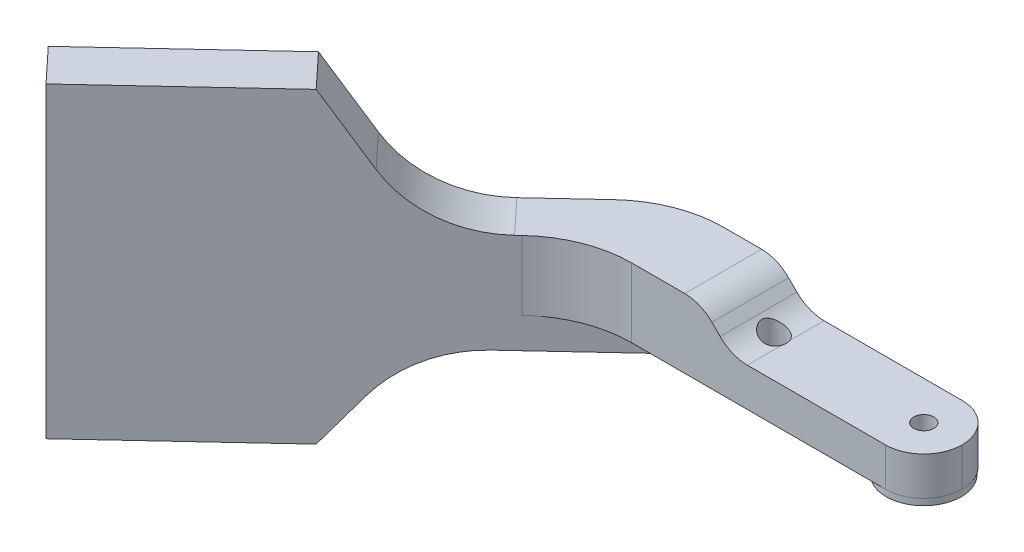
ISO-10303-21;
HEADER;
FILE_DESCRIPTION(('STEP AP214'),'2;1');
FILE_NAME('part.step','',(''),(''),'','','');
FILE_SCHEMA(('AUTOMOTIVE_DESIGN { 1 0 10303 214 1 1 1 1 }'));
ENDSEC;
DATA;
#1=APPLICATION_CONTEXT('core data for automotive mechanical design processes');
#2=APPLICATION_PROTOCOL_DEFINITION('international standard','automotive_design',2000,#1);
#3=PRODUCT_CONTEXT('',#1,'mechanical');
#4=PRODUCT('Part','Part','',(#3));
#5=PRODUCT_RELATED_PRODUCT_CATEGORY('part','',(#4));
#6=PRODUCT_DEFINITION_FORMATION('','',#4);
#7=PRODUCT_DEFINITION_CONTEXT('part definition',#1,'design');
#8=PRODUCT_DEFINITION('design','',#6,#7);
#9=PRODUCT_DEFINITION_SHAPE('','',#8);
#10=(LENGTH_UNIT() NAMED_UNIT(*) SI_UNIT(.MILLI.,.METRE.));
#11=(NAMED_UNIT(*) PLANE_ANGLE_UNIT() SI_UNIT($,.RADIAN.));
#12=(NAMED_UNIT(*) SI_UNIT($,.STERADIAN.) SOLID_ANGLE_UNIT());
#13=UNCERTAINTY_MEASURE_WITH_UNIT(LENGTH_MEASURE(1.E-05),#10,'distance_accuracy_value','');
#14=(GEOMETRIC_REPRESENTATION_CONTEXT(3) GLOBAL_UNCERTAINTY_ASSIGNED_CONTEXT((#13)) GLOBAL_UNIT_ASSIGNED_CONTEXT((#10,
#11,#12)) REPRESENTATION_CONTEXT('',''));
#15=CARTESIAN_POINT('',(0.,0.,0.));
#16=DIRECTION('',(0.,0.,1.));
#17=DIRECTION('',(1.,0.,0.));
#18=AXIS2_PLACEMENT_3D('',#15,#16,#17);
#19=CARTESIAN_POINT('',(0.,0.,0.));
#20=DIRECTION('',(0.,1.,0.));
#21=DIRECTION('',(0.,0.,1.));
#22=AXIS2_PLACEMENT_3D('',#19,#20,#21);
#23=PLANE('',#22);
#24=CARTESIAN_POINT('',(17.4999999999992,0.,-5.00000000000141));
#25=DIRECTION('',(0.,-1.,0.));
#26=DIRECTION('',(0.,0.,-1.));
#27=AXIS2_PLACEMENT_3D('',#24,#25,#26);
#28=CIRCLE('',#27,1.6);
#29=CARTESIAN_POINT('',(17.4999999999992,0.,-6.60000000000141));
#30=VERTEX_POINT('',#29);
#31=EDGE_CURVE('E194',#30,#30,#28,.T.);
#32=ORIENTED_EDGE('',*,*,#31,.F.);
#33=EDGE_LOOP('',(#32));
#34=FACE_BOUND('',#33,.T.);
#35=CARTESIAN_POINT('',(37.,0.,-4.99999999999999));
#36=DIRECTION('',(0.,1.,0.));
#37=DIRECTION('',(0.,0.,1.));
#38=AXIS2_PLACEMENT_3D('',#35,#36,#37);
#39=CIRCLE('',#38,4.9);
#40=CARTESIAN_POINT('',(37.,0.,-0.0999999999999873));
#41=VERTEX_POINT('',#40);
#42=EDGE_CURVE('E245',#41,#41,#39,.F.);
#43=ORIENTED_EDGE('',*,*,#42,.F.);
#44=EDGE_LOOP('',(#43));
#45=FACE_BOUND('',#44,.T.);
#46=DIRECTION('',(-0.731353701619174,0.,0.681998360062495));
#47=VECTOR('',#46,1.);
#48=CARTESIAN_POINT('',(-15.5899264830256,0.,12.7418064037898));
#49=LINE('',#48,#47);
#50=CARTESIAN_POINT('',(8.79767511383777,0.,-10.));
#51=VERTEX_POINT('',#50);
#52=CARTESIAN_POINT('',(-6.24733025312248,0.,4.02969447571239));
#53=VERTEX_POINT('',#52);
#54=EDGE_CURVE('E327',#51,#53,#49,.T.);
#55=ORIENTED_EDGE('',*,*,#54,.F.);
#56=DIRECTION('',(1.,0.,0.));
#57=VECTOR('',#56,1.);
#58=CARTESIAN_POINT('',(0.,0.,-10.));
#59=LINE('',#58,#57);
#60=CARTESIAN_POINT('',(37.,0.,-10.));
#61=VERTEX_POINT('',#60);
#62=EDGE_CURVE('E223',#51,#61,#59,.T.);
#63=ORIENTED_EDGE('',*,*,#62,.T.);
#64=CARTESIAN_POINT('',(37.,0.,-5.));
#65=DIRECTION('',(0.,1.,0.));
#66=DIRECTION('',(0.,0.,1.));
#67=AXIS2_PLACEMENT_3D('',#64,#65,#66);
#68=CIRCLE('',#67,5.);
#69=CARTESIAN_POINT('',(42.,0.,-5.));
#70=VERTEX_POINT('',#69);
#71=EDGE_CURVE('E233',#61,#70,#68,.F.);
#72=ORIENTED_EDGE('',*,*,#71,.T.);
#73=CARTESIAN_POINT('',(37.,0.,-5.00000000000001));
#74=DIRECTION('',(0.,1.,0.));
#75=DIRECTION('',(0.,0.,1.));
#76=AXIS2_PLACEMENT_3D('',#73,#74,#75);
#77=CIRCLE('',#76,5.);
#78=CARTESIAN_POINT('',(37.,0.,0.));
#79=VERTEX_POINT('',#78);
#80=EDGE_CURVE('E235',#70,#79,#77,.F.);
#81=ORIENTED_EDGE('',*,*,#80,.T.);
#82=DIRECTION('',(-1.,0.,0.));
#83=VECTOR('',#82,1.);
#84=CARTESIAN_POINT('',(0.,0.,0.));
#85=LINE('',#84,#83);
#86=CARTESIAN_POINT('',(3.98264514781494,0.,0.));
#87=VERTEX_POINT('',#86);
#88=EDGE_CURVE('E227',#79,#87,#85,.T.);
#89=ORIENTED_EDGE('',*,*,#88,.T.);
#90=CARTESIAN_POINT('',(3.98264514781494,0.,15.));
#91=DIRECTION('',(0.,1.,0.));
#92=DIRECTION('',(0.,0.,1.));
#93=AXIS2_PLACEMENT_3D('',#90,#91,#92);
#94=CIRCLE('',#93,15.);
#95=EDGE_CURVE('E276',#87,#53,#94,.T.);
#96=ORIENTED_EDGE('',*,*,#95,.T.);
#97=EDGE_LOOP('',(#55,#63,#72,#81,#89,#96));
#98=FACE_BOUND('',#97,.T.);
#99=ADVANCED_FACE('F38',(#34,#45,#98),#23,.F.);
#100=CARTESIAN_POINT('',(-11.0535847060781,0.,8.51159926090981));
#101=DIRECTION('',(0.563586903258906,-0.637309612531581,-0.525553289638531));
#102=DIRECTION('',(0.74910562425053,0.662450574545923,0.));
#103=AXIS2_PLACEMENT_3D('',#100,#101,#102);
#104=PLANE('',#103);
#105=DIRECTION('',(-0.466098744202454,-0.770607849541416,0.434644110598602));
#106=VECTOR('',#105,1.);
#107=CARTESIAN_POINT('',(-15.1455748664531,0.,4.12347705119476));
#108=LINE('',#107,#106);
#109=CARTESIAN_POINT('',(-20.8555322610323,-9.44035581202628,9.4480984628431));
#110=VERTEX_POINT('',#109);
#111=CARTESIAN_POINT('',(-24.2182584203481,-15.,12.5838913369548));
#112=VERTEX_POINT('',#111);
#113=EDGE_CURVE('E349',#110,#112,#108,.T.);
#114=ORIENTED_EDGE('',*,*,#113,.F.);
#115=DIRECTION('',(0.681998360062495,0.,0.731353701619174));
#116=VECTOR('',#115,1.);
#117=CARTESIAN_POINT('',(-16.7635421006573,-9.44035581202628,13.8362206725581));
#118=LINE('',#117,#116);
#119=CARTESIAN_POINT('',(-16.7635421006573,-9.44035581202628,13.8362206725581));
#120=VERTEX_POINT('',#119);
#121=EDGE_CURVE('E271',#110,#120,#118,.T.);
#122=ORIENTED_EDGE('',*,*,#121,.T.);
#123=DIRECTION('',(-0.466098744202454,-0.770607849541416,0.434644110598602));
#124=VECTOR('',#123,1.);
#125=CARTESIAN_POINT('',(-11.0535847060781,0.,8.51159926090981));
#126=LINE('',#125,#124);
#127=CARTESIAN_POINT('',(-20.1262682599731,-15.,16.9720135466699));
#128=VERTEX_POINT('',#127);
#129=EDGE_CURVE('E352',#120,#128,#126,.T.);
#130=ORIENTED_EDGE('',*,*,#129,.T.);
#131=DIRECTION('',(0.681998360062494,0.,0.731353701619174));
#132=VECTOR('',#131,1.);
#133=CARTESIAN_POINT('',(-20.1262682599731,-15.,16.9720135466699));
#134=LINE('',#133,#132);
#135=EDGE_CURVE('E358',#112,#128,#134,.T.);
#136=ORIENTED_EDGE('',*,*,#135,.F.);
#137=EDGE_LOOP('',(#114,#122,#130,#136));
#138=FACE_BOUND('',#137,.T.);
#139=ADVANCED_FACE('F401',(#138),#104,.T.);
#140=CARTESIAN_POINT('',(0.,5.,0.));
#141=DIRECTION('',(0.,0.,1.));
#142=DIRECTION('',(1.,0.,0.));
#143=AXIS2_PLACEMENT_3D('',#140,#141,#142);
#144=PLANE('',#143);
#145=DIRECTION('',(0.707106781186548,-0.707106781186547,0.));
#146=VECTOR('',#145,1.);
#147=CARTESIAN_POINT('',(8.4752602127433,13.4752602127433,0.));
#148=LINE('',#147,#146);
#149=CARTESIAN_POINT('',(15.4860543314193,6.46446609406726,0.));
#150=VERTEX_POINT('',#149);
#151=CARTESIAN_POINT('',(14.4149865195539,7.53553390593273,0.));
#152=VERTEX_POINT('',#151);
#153=EDGE_CURVE('E289',#150,#152,#148,.F.);
#154=ORIENTED_EDGE('',*,*,#153,.T.);
#155=CARTESIAN_POINT('',(10.8794526136211,4.,0.));
#156=DIRECTION('',(0.,0.,1.));
#157=DIRECTION('',(1.,0.,0.));
#158=AXIS2_PLACEMENT_3D('',#155,#156,#157);
#159=CIRCLE('',#158,5.);
#160=CARTESIAN_POINT('',(10.8794526136211,9.,0.));
#161=VERTEX_POINT('',#160);
#162=EDGE_CURVE('E199',#152,#161,#159,.T.);
#163=ORIENTED_EDGE('',*,*,#162,.T.);
#164=DIRECTION('',(1.,0.,0.));
#165=VECTOR('',#164,1.);
#166=CARTESIAN_POINT('',(0.,9.,0.));
#167=LINE('',#166,#165);
#168=CARTESIAN_POINT('',(3.98264514781494,9.,0.));
#169=VERTEX_POINT('',#168);
#170=EDGE_CURVE('E313',#169,#161,#167,.T.);
#171=ORIENTED_EDGE('',*,*,#170,.F.);
#172=DIRECTION('',(0.,-1.,0.));
#173=VECTOR('',#172,1.);
#174=CARTESIAN_POINT('',(3.98264514781494,5.,0.));
#175=LINE('',#174,#173);
#176=EDGE_CURVE('E266',#169,#87,#175,.T.);
#177=ORIENTED_EDGE('',*,*,#176,.T.);
#178=ORIENTED_EDGE('',*,*,#88,.F.);
#179=DIRECTION('',(0.,-1.,0.));
#180=VECTOR('',#179,1.);
#181=CARTESIAN_POINT('',(37.,5.,0.));
#182=LINE('',#181,#180);
#183=CARTESIAN_POINT('',(37.,5.,0.));
#184=VERTEX_POINT('',#183);
#185=EDGE_CURVE('E237',#79,#184,#182,.F.);
#186=ORIENTED_EDGE('',*,*,#185,.T.);
#187=DIRECTION('',(-1.,0.,0.));
#188=VECTOR('',#187,1.);
#189=CARTESIAN_POINT('',(0.,5.,0.));
#190=LINE('',#189,#188);
#191=CARTESIAN_POINT('',(19.0215882373521,5.,0.));
#192=VERTEX_POINT('',#191);
#193=EDGE_CURVE('E219',#184,#192,#190,.T.);
#194=ORIENTED_EDGE('',*,*,#193,.T.);
#195=CARTESIAN_POINT('',(19.0215882373521,10.,0.));
#196=DIRECTION('',(0.,0.,1.));
#197=DIRECTION('',(1.,0.,0.));
#198=AXIS2_PLACEMENT_3D('',#195,#196,#197);
#199=CIRCLE('',#198,5.);
#200=EDGE_CURVE('E197',#192,#150,#199,.F.);
#201=ORIENTED_EDGE('',*,*,#200,.T.);
#202=EDGE_LOOP('',(#154,#163,#171,#177,#178,#186,#194,#201));
#203=FACE_BOUND('',#202,.T.);
#204=ADVANCED_FACE('F306',(#203),#144,.T.);
#205=CARTESIAN_POINT('',(0.,5.,-10.));
#206=DIRECTION('',(0.,0.,-1.));
#207=DIRECTION('',(-1.,0.,0.));
#208=AXIS2_PLACEMENT_3D('',#205,#206,#207);
#209=PLANE('',#208);
#210=DIRECTION('',(-1.,0.,0.));
#211=VECTOR('',#210,1.);
#212=CARTESIAN_POINT('',(0.,9.,-10.));
#213=LINE('',#212,#211);
#214=CARTESIAN_POINT('',(10.8794526136211,9.,-10.));
#215=VERTEX_POINT('',#214);
#216=CARTESIAN_POINT('',(5.90865713422409,9.,-10.));
#217=VERTEX_POINT('',#216);
#218=EDGE_CURVE('E193',#215,#217,#213,.T.);
#219=ORIENTED_EDGE('',*,*,#218,.F.);
#220=CARTESIAN_POINT('',(10.8794526136211,4.,-10.));
#221=DIRECTION('',(0.,0.,-1.));
#222=DIRECTION('',(-1.,0.,0.));
#223=AXIS2_PLACEMENT_3D('',#220,#221,#222);
#224=CIRCLE('',#223,5.);
#225=CARTESIAN_POINT('',(14.4149865195539,7.53553390593273,-10.));
#226=VERTEX_POINT('',#225);
#227=EDGE_CURVE('E296',#215,#226,#224,.T.);
#228=ORIENTED_EDGE('',*,*,#227,.T.);
#229=DIRECTION('',(-0.707106781186548,0.707106781186547,0.));
#230=VECTOR('',#229,1.);
#231=CARTESIAN_POINT('',(8.4752602127433,13.4752602127433,-10.));
#232=LINE('',#231,#230);
#233=CARTESIAN_POINT('',(15.4860543314193,6.46446609406726,-10.));
#234=VERTEX_POINT('',#233);
#235=EDGE_CURVE('E214',#226,#234,#232,.F.);
#236=ORIENTED_EDGE('',*,*,#235,.T.);
#237=CARTESIAN_POINT('',(19.0215882373521,10.,-10.));
#238=DIRECTION('',(0.,0.,-1.));
#239=DIRECTION('',(-1.,0.,0.));
#240=AXIS2_PLACEMENT_3D('',#237,#238,#239);
#241=CIRCLE('',#240,5.);
#242=CARTESIAN_POINT('',(19.0215882373521,5.,-10.));
#243=VERTEX_POINT('',#242);
#244=EDGE_CURVE('E52',#234,#243,#241,.F.);
#245=ORIENTED_EDGE('',*,*,#244,.T.);
#246=DIRECTION('',(1.,0.,0.));
#247=VECTOR('',#246,1.);
#248=CARTESIAN_POINT('',(0.,5.,-10.));
#249=LINE('',#248,#247);
#250=CARTESIAN_POINT('',(37.,5.,-10.));
#251=VERTEX_POINT('',#250);
#252=EDGE_CURVE('E211',#243,#251,#249,.T.);
#253=ORIENTED_EDGE('',*,*,#252,.T.);
#254=DIRECTION('',(0.,-1.,0.));
#255=VECTOR('',#254,1.);
#256=CARTESIAN_POINT('',(37.,0.,-10.));
#257=LINE('',#256,#255);
#258=EDGE_CURVE('E243',#251,#61,#257,.T.);
#259=ORIENTED_EDGE('',*,*,#258,.T.);
#260=ORIENTED_EDGE('',*,*,#62,.F.);
#261=DIRECTION('',(0.,1.,0.));
#262=VECTOR('',#261,1.);
#263=CARTESIAN_POINT('',(8.79767511383777,-4.,-10.));
#264=LINE('',#263,#262);
#265=CARTESIAN_POINT('',(8.79767511383777,-4.,-10.));
#266=VERTEX_POINT('',#265);
#267=EDGE_CURVE('E336',#266,#51,#264,.T.);
#268=ORIENTED_EDGE('',*,*,#267,.F.);
#269=DIRECTION('',(1.,0.,0.));
#270=VECTOR('',#269,1.);
#271=CARTESIAN_POINT('',(8.79767511383777,-4.,-10.));
#272=LINE('',#271,#270);
#273=CARTESIAN_POINT('',(5.90865713422409,-4.,-10.));
#274=VERTEX_POINT('',#273);
#275=EDGE_CURVE('E328',#274,#266,#272,.T.);
#276=ORIENTED_EDGE('',*,*,#275,.F.);
#277=DIRECTION('',(0.,-1.,0.));
#278=VECTOR('',#277,1.);
#279=CARTESIAN_POINT('',(5.90865713422409,9.,-10.));
#280=LINE('',#279,#278);
#281=EDGE_CURVE('E258',#274,#217,#280,.F.);
#282=ORIENTED_EDGE('',*,*,#281,.T.);
#283=EDGE_LOOP('',(#219,#228,#236,#245,#253,#259,#260,#268,#276,#282));
#284=FACE_BOUND('',#283,.T.);
#285=ADVANCED_FACE('F209',(#284),#209,.T.);
#286=CARTESIAN_POINT('',(-4.98782025129912,5.,-5.34878236872068));
#287=DIRECTION('',(0.681998360062495,0.,0.731353701619174));
#288=DIRECTION('',(0.731353701619174,0.,-0.681998360062495));
#289=AXIS2_PLACEMENT_3D('',#286,#287,#288);
#290=PLANE('',#289);
#291=DIRECTION('',(-0.731353701619174,0.,0.681998360062495));
#292=VECTOR('',#291,1.);
#293=CARTESIAN_POINT('',(-4.98782025129912,9.,-5.34878236872068));
#294=LINE('',#293,#292);
#295=CARTESIAN_POINT('',(-4.32131826671333,9.,-5.97030552428761));
#296=VERTEX_POINT('',#295);
#297=CARTESIAN_POINT('',(-10.8553641588959,9.,0.122790843688388));
#298=VERTEX_POINT('',#297);
#299=EDGE_CURVE('E317',#296,#298,#294,.T.);
#300=ORIENTED_EDGE('',*,*,#299,.F.);
#301=DIRECTION('',(0.,-1.,0.));
#302=VECTOR('',#301,1.);
#303=CARTESIAN_POINT('',(-4.32131826671333,-4.,-5.97030552428761));
#304=LINE('',#303,#302);
#305=CARTESIAN_POINT('',(-4.32131826671333,-4.,-5.97030552428761));
#306=VERTEX_POINT('',#305);
#307=EDGE_CURVE('E251',#296,#306,#304,.T.);
#308=ORIENTED_EDGE('',*,*,#307,.T.);
#309=DIRECTION('',(0.731353701619174,0.,-0.681998360062495));
#310=VECTOR('',#309,1.);
#311=CARTESIAN_POINT('',(0.,-4.,-10.));
#312=LINE('',#311,#310);
#313=CARTESIAN_POINT('',(-12.4017287121487,-4.,1.56479911826513));
#314=VERTEX_POINT('',#313);
#315=EDGE_CURVE('E333',#314,#306,#312,.T.);
#316=ORIENTED_EDGE('',*,*,#315,.F.);
#317=CARTESIAN_POINT('',(-12.4017287121487,-19.,1.56479911826513));
#318=DIRECTION('',(0.681998360062495,0.,0.731353701619174));
#319=DIRECTION('',(0.731353701619174,0.,-0.681998360062495));
#320=AXIS2_PLACEMENT_3D('',#317,#318,#319);
#321=CIRCLE('',#320,15.);
#322=EDGE_CURVE('E283',#314,#110,#321,.T.);
#323=ORIENTED_EDGE('',*,*,#322,.T.);
#324=ORIENTED_EDGE('',*,*,#113,.T.);
#325=DIRECTION('',(0.731353701619174,0.,-0.681998360062495));
#326=VECTOR('',#325,1.);
#327=CARTESIAN_POINT('',(-24.2182584203481,-15.,12.5838913369548));
#328=LINE('',#327,#326);
#329=CARTESIAN_POINT('',(-42.4185146939121,-15.,29.5559048836247));
#330=VERTEX_POINT('',#329);
#331=EDGE_CURVE('E354',#330,#112,#328,.T.);
#332=ORIENTED_EDGE('',*,*,#331,.F.);
#333=DIRECTION('',(0.,-1.,0.));
#334=VECTOR('',#333,1.);
#335=CARTESIAN_POINT('',(-42.4185146939121,5.,29.5559048836247));
#336=LINE('',#335,#334);
#337=CARTESIAN_POINT('',(-42.4185146939121,25.,29.5559048836247));
#338=VERTEX_POINT('',#337);
#339=EDGE_CURVE('E221',#338,#330,#336,.T.);
#340=ORIENTED_EDGE('',*,*,#339,.F.);
#341=DIRECTION('',(-0.731353701619174,0.,0.681998360062495));
#342=VECTOR('',#341,1.);
#343=CARTESIAN_POINT('',(-24.2182584203481,25.,12.5838913369548));
#344=LINE('',#343,#342);
#345=CARTESIAN_POINT('',(-24.2182584203481,25.,12.5838913369548));
#346=VERTEX_POINT('',#345);
#347=EDGE_CURVE('E367',#346,#338,#344,.T.);
#348=ORIENTED_EDGE('',*,*,#347,.F.);
#349=DIRECTION('',(0.385498897170092,-0.84980126305539,-0.359483537300538));
#350=VECTOR('',#349,1.);
#351=CARTESIAN_POINT('',(-15.1455748664531,5.,4.12347705119476));
#352=LINE('',#351,#350);
#353=CARTESIAN_POINT('',(-20.177943649539,16.0934515751417,8.81623686043057));
#354=VERTEX_POINT('',#353);
#355=EDGE_CURVE('E345',#346,#354,#352,.T.);
#356=ORIENTED_EDGE('',*,*,#355,.T.);
#357=CARTESIAN_POINT('',(-10.8553641588959,24.,0.122790843688387));
#358=DIRECTION('',(0.681998360062495,0.,0.731353701619174));
#359=DIRECTION('',(0.731353701619174,0.,-0.681998360062495));
#360=AXIS2_PLACEMENT_3D('',#357,#358,#359);
#361=CIRCLE('',#360,15.);
#362=EDGE_CURVE('E287',#354,#298,#361,.T.);
#363=ORIENTED_EDGE('',*,*,#362,.T.);
#364=EDGE_LOOP('',(#300,#308,#316,#323,#324,#332,#340,#348,#356,#363));
#365=FACE_BOUND('',#364,.T.);
#366=ADVANCED_FACE('F414',(#365),#290,.F.);
#367=CARTESIAN_POINT('',(-37.430694442613,5.,34.9046872523454));
#368=DIRECTION('',(0.731353701619174,0.,-0.681998360062495));
#369=DIRECTION('',(-0.681998360062495,0.,-0.731353701619174));
#370=AXIS2_PLACEMENT_3D('',#367,#368,#369);
#371=PLANE('',#370);
#372=ORIENTED_EDGE('',*,*,#339,.T.);
#373=DIRECTION('',(-0.681998360062496,0.,-0.731353701619173));
#374=VECTOR('',#373,1.);
#375=CARTESIAN_POINT('',(-42.4185146939121,-15.,29.5559048836247));
#376=LINE('',#375,#374);
#377=CARTESIAN_POINT('',(-38.3265245335371,-15.,33.9440270933397));
#378=VERTEX_POINT('',#377);
#379=EDGE_CURVE('E364',#378,#330,#376,.T.);
#380=ORIENTED_EDGE('',*,*,#379,.F.);
#381=DIRECTION('',(0.,-1.,0.));
#382=VECTOR('',#381,1.);
#383=CARTESIAN_POINT('',(-38.3265245335371,5.,33.9440270933397));
#384=LINE('',#383,#382);
#385=CARTESIAN_POINT('',(-38.3265245335371,25.,33.9440270933397));
#386=VERTEX_POINT('',#385);
#387=EDGE_CURVE('E218',#386,#378,#384,.T.);
#388=ORIENTED_EDGE('',*,*,#387,.F.);
#389=DIRECTION('',(0.681998360062496,0.,0.731353701619173));
#390=VECTOR('',#389,1.);
#391=CARTESIAN_POINT('',(-42.4185146939121,25.,29.5559048836247));
#392=LINE('',#391,#390);
#393=EDGE_CURVE('E370',#338,#386,#392,.T.);
#394=ORIENTED_EDGE('',*,*,#393,.F.);
#395=EDGE_LOOP('',(#372,#380,#388,#394));
#396=FACE_BOUND('',#395,.T.);
#397=ADVANCED_FACE('F396',(#396),#371,.F.);
#398=CARTESIAN_POINT('',(-0.895830090924156,5.,-0.960660159005641));
#399=DIRECTION('',(-0.681998360062495,0.,-0.731353701619174));
#400=DIRECTION('',(-0.731353701619174,0.,0.681998360062495));
#401=AXIS2_PLACEMENT_3D('',#398,#399,#400);
#402=PLANE('',#401);
#403=ORIENTED_EDGE('',*,*,#54,.T.);
#404=DIRECTION('',(0.,-1.,0.));
#405=VECTOR('',#404,1.);
#406=CARTESIAN_POINT('',(-6.24733025312248,5.,4.02969447571239));
#407=LINE('',#406,#405);
#408=CARTESIAN_POINT('',(-6.24733025312248,9.,4.02969447571239));
#409=VERTEX_POINT('',#408);
#410=EDGE_CURVE('E269',#53,#409,#407,.F.);
#411=ORIENTED_EDGE('',*,*,#410,.T.);
#412=DIRECTION('',(0.731353701619174,0.,-0.681998360062495));
#413=VECTOR('',#412,1.);
#414=CARTESIAN_POINT('',(-0.895830090924156,9.,-0.960660159005641));
#415=LINE('',#414,#413);
#416=CARTESIAN_POINT('',(-6.76337399852093,9.,4.51091305340342));
#417=VERTEX_POINT('',#416);
#418=EDGE_CURVE('E320',#417,#409,#415,.T.);
#419=ORIENTED_EDGE('',*,*,#418,.F.);
#420=CARTESIAN_POINT('',(-6.76337399852093,24.,4.51091305340342));
#421=DIRECTION('',(-0.681998360062495,0.,-0.731353701619174));
#422=DIRECTION('',(-0.731353701619174,0.,0.681998360062495));
#423=AXIS2_PLACEMENT_3D('',#420,#421,#422);
#424=CIRCLE('',#423,15.);
#425=CARTESIAN_POINT('',(-16.0859534891641,16.0934515751417,13.2043590701456));
#426=VERTEX_POINT('',#425);
#427=EDGE_CURVE('E285',#417,#426,#424,.T.);
#428=ORIENTED_EDGE('',*,*,#427,.T.);
#429=DIRECTION('',(0.385498897170092,-0.84980126305539,-0.359483537300538));
#430=VECTOR('',#429,1.);
#431=CARTESIAN_POINT('',(-11.0535847060781,5.,8.51159926090981));
#432=LINE('',#431,#430);
#433=CARTESIAN_POINT('',(-20.1262682599731,25.,16.9720135466699));
#434=VERTEX_POINT('',#433);
#435=EDGE_CURVE('E346',#434,#426,#432,.T.);
#436=ORIENTED_EDGE('',*,*,#435,.F.);
#437=DIRECTION('',(0.731353701619174,0.,-0.681998360062495));
#438=VECTOR('',#437,1.);
#439=CARTESIAN_POINT('',(-38.3265245335371,25.,33.9440270933397));
#440=LINE('',#439,#438);
#441=EDGE_CURVE('E373',#386,#434,#440,.T.);
#442=ORIENTED_EDGE('',*,*,#441,.F.);
#443=ORIENTED_EDGE('',*,*,#387,.T.);
#444=DIRECTION('',(-0.731353701619174,0.,0.681998360062494));
#445=VECTOR('',#444,1.);
#446=CARTESIAN_POINT('',(-38.3265245335371,-15.,33.9440270933397));
#447=LINE('',#446,#445);
#448=EDGE_CURVE('E361',#128,#378,#447,.T.);
#449=ORIENTED_EDGE('',*,*,#448,.F.);
#450=ORIENTED_EDGE('',*,*,#129,.F.);
#451=CARTESIAN_POINT('',(-8.30973855177373,-19.,5.95292132798017));
#452=DIRECTION('',(-0.681998360062495,0.,-0.731353701619174));
#453=DIRECTION('',(-0.731353701619174,0.,0.681998360062495));
#454=AXIS2_PLACEMENT_3D('',#451,#452,#453);
#455=CIRCLE('',#454,15.);
#456=CARTESIAN_POINT('',(-8.30973855177373,-4.,5.95292132798017));
#457=VERTEX_POINT('',#456);
#458=EDGE_CURVE('E281',#120,#457,#455,.T.);
#459=ORIENTED_EDGE('',*,*,#458,.T.);
#460=DIRECTION('',(-0.731353701619174,0.,0.681998360062495));
#461=VECTOR('',#460,1.);
#462=CARTESIAN_POINT('',(-15.5899264830256,-4.,12.7418064037898));
#463=LINE('',#462,#461);
#464=EDGE_CURVE('E330',#266,#457,#463,.T.);
#465=ORIENTED_EDGE('',*,*,#464,.F.);
#466=ORIENTED_EDGE('',*,*,#267,.T.);
#467=EDGE_LOOP('',(#403,#411,#419,#428,#436,#442,#443,#449,#450,#459,#465,#466));
#468=FACE_BOUND('',#467,.T.);
#469=ADVANCED_FACE('F385',(#468),#402,.F.);
#470=CARTESIAN_POINT('',(0.,5.,0.));
#471=DIRECTION('',(0.,1.,0.));
#472=DIRECTION('',(0.,0.,1.));
#473=AXIS2_PLACEMENT_3D('',#470,#471,#472);
#474=PLANE('',#473);
#475=CARTESIAN_POINT('',(17.4999999999992,5.,-5.00000000000141));
#476=DIRECTION('',(0.,1.,0.));
#477=DIRECTION('',(0.,0.,1.));
#478=AXIS2_PLACEMENT_3D('',#475,#476,#477);
#479=CIRCLE('',#478,1.6);
#480=CARTESIAN_POINT('',(19.0215882373521,5.,-4.50525841498002));
#481=VERTEX_POINT('',#480);
#482=CARTESIAN_POINT('',(19.0215882373521,5.,-5.49474158502279));
#483=VERTEX_POINT('',#482);
#484=EDGE_CURVE('E58',#481,#483,#479,.T.);
#485=ORIENTED_EDGE('',*,*,#484,.F.);
#486=DIRECTION('',(0.,0.,-1.));
#487=VECTOR('',#486,1.);
#488=CARTESIAN_POINT('',(19.0215882373521,5.,0.));
#489=LINE('',#488,#487);
#490=EDGE_CURVE('E64',#481,#192,#489,.F.);
#491=ORIENTED_EDGE('',*,*,#490,.T.);
#492=ORIENTED_EDGE('',*,*,#193,.F.);
#493=CARTESIAN_POINT('',(37.,5.,-5.00000000000001));
#494=DIRECTION('',(0.,1.,0.));
#495=DIRECTION('',(0.,0.,1.));
#496=AXIS2_PLACEMENT_3D('',#493,#494,#495);
#497=CIRCLE('',#496,5.);
#498=CARTESIAN_POINT('',(42.,5.,-5.));
#499=VERTEX_POINT('',#498);
#500=EDGE_CURVE('E241',#184,#499,#497,.T.);
#501=ORIENTED_EDGE('',*,*,#500,.T.);
#502=CARTESIAN_POINT('',(37.,5.,-5.));
#503=DIRECTION('',(0.,1.,0.));
#504=DIRECTION('',(0.,0.,1.));
#505=AXIS2_PLACEMENT_3D('',#502,#503,#504);
#506=CIRCLE('',#505,5.);
#507=EDGE_CURVE('E216',#499,#251,#506,.T.);
#508=ORIENTED_EDGE('',*,*,#507,.T.);
#509=ORIENTED_EDGE('',*,*,#252,.F.);
#510=EDGE_CURVE('E192',#243,#483,#489,.F.);
#511=ORIENTED_EDGE('',*,*,#510,.T.);
#512=EDGE_LOOP('',(#485,#491,#492,#501,#508,#509,#511));
#513=FACE_BOUND('',#512,.T.);
#514=CARTESIAN_POINT('',(37.,5.,-4.99999999999999));
#515=DIRECTION('',(0.,1.,0.));
#516=DIRECTION('',(0.,0.,1.));
#517=AXIS2_PLACEMENT_3D('',#514,#515,#516);
#518=CIRCLE('',#517,1.29999999999999);
#519=CARTESIAN_POINT('',(37.,5.,-3.69999999999999));
#520=VERTEX_POINT('',#519);
#521=EDGE_CURVE('E248',#520,#520,#518,.T.);
#522=ORIENTED_EDGE('',*,*,#521,.F.);
#523=EDGE_LOOP('',(#522));
#524=FACE_BOUND('',#523,.T.);
#525=ADVANCED_FACE('F189',(#513,#524),#474,.T.);
#526=CARTESIAN_POINT('',(37.,5.,-5.));
#527=DIRECTION('',(0.,1.,0.));
#528=DIRECTION('',(0.,0.,1.));
#529=AXIS2_PLACEMENT_3D('',#526,#527,#528);
#530=CYLINDRICAL_SURFACE('',#529,5.);
#531=ORIENTED_EDGE('',*,*,#258,.F.);
#532=ORIENTED_EDGE('',*,*,#507,.F.);
#533=DIRECTION('',(0.,-1.,0.));
#534=VECTOR('',#533,1.);
#535=CARTESIAN_POINT('',(42.,5.,-5.));
#536=LINE('',#535,#534);
#537=EDGE_CURVE('E230',#70,#499,#536,.F.);
#538=ORIENTED_EDGE('',*,*,#537,.F.);
#539=ORIENTED_EDGE('',*,*,#71,.F.);
#540=EDGE_LOOP('',(#531,#532,#538,#539));
#541=FACE_BOUND('',#540,.T.);
#542=ADVANCED_FACE('F384',(#541),#530,.T.);
#543=CARTESIAN_POINT('',(37.,5.,-5.00000000000001));
#544=DIRECTION('',(0.,1.,0.));
#545=DIRECTION('',(0.,0.,1.));
#546=AXIS2_PLACEMENT_3D('',#543,#544,#545);
#547=CYLINDRICAL_SURFACE('',#546,5.);
#548=ORIENTED_EDGE('',*,*,#500,.F.);
#549=ORIENTED_EDGE('',*,*,#185,.F.);
#550=ORIENTED_EDGE('',*,*,#80,.F.);
#551=ORIENTED_EDGE('',*,*,#537,.T.);
#552=EDGE_LOOP('',(#548,#549,#550,#551));
#553=FACE_BOUND('',#552,.T.);
#554=ADVANCED_FACE('F392',(#553),#547,.T.);
#555=CARTESIAN_POINT('',(37.,-5.,-4.99999999999999));
#556=DIRECTION('',(0.,1.,0.));
#557=DIRECTION('',(0.,0.,1.));
#558=AXIS2_PLACEMENT_3D('',#555,#556,#557);
#559=CYLINDRICAL_SURFACE('',#558,1.29999999999999);
#560=ORIENTED_EDGE('',*,*,#521,.T.);
#561=EDGE_LOOP('',(#560));
#562=FACE_BOUND('',#561,.T.);
#563=CARTESIAN_POINT('',(37.,-0.9,-4.99999999999999));
#564=DIRECTION('',(0.,-1.,0.));
#565=DIRECTION('',(0.,0.,-1.));
#566=AXIS2_PLACEMENT_3D('',#563,#564,#565);
#567=CIRCLE('',#566,1.29999999999999);
#568=CARTESIAN_POINT('',(37.,-0.9,-6.29999999999998));
#569=VERTEX_POINT('',#568);
#570=EDGE_CURVE('E339',#569,#569,#567,.T.);
#571=ORIENTED_EDGE('',*,*,#570,.T.);
#572=EDGE_LOOP('',(#571));
#573=FACE_BOUND('',#572,.T.);
#574=ADVANCED_FACE('F381',(#562,#573),#559,.F.);
#575=CARTESIAN_POINT('',(0.,25.,0.));
#576=DIRECTION('',(0.,1.,0.));
#577=DIRECTION('',(0.,0.,1.));
#578=AXIS2_PLACEMENT_3D('',#575,#576,#577);
#579=PLANE('',#578);
#580=ORIENTED_EDGE('',*,*,#347,.T.);
#581=ORIENTED_EDGE('',*,*,#393,.T.);
#582=ORIENTED_EDGE('',*,*,#441,.T.);
#583=DIRECTION('',(-0.681998360062495,0.,-0.731353701619174));
#584=VECTOR('',#583,1.);
#585=CARTESIAN_POINT('',(-20.1262682599731,25.,16.9720135466699));
#586=LINE('',#585,#584);
#587=EDGE_CURVE('E376',#434,#346,#586,.T.);
#588=ORIENTED_EDGE('',*,*,#587,.T.);
#589=EDGE_LOOP('',(#580,#581,#582,#588));
#590=FACE_BOUND('',#589,.T.);
#591=ADVANCED_FACE('F473',(#590),#579,.T.);
#592=CARTESIAN_POINT('',(0.,-15.,0.));
#593=DIRECTION('',(0.,1.,0.));
#594=DIRECTION('',(0.,0.,1.));
#595=AXIS2_PLACEMENT_3D('',#592,#593,#594);
#596=PLANE('',#595);
#597=ORIENTED_EDGE('',*,*,#331,.T.);
#598=ORIENTED_EDGE('',*,*,#135,.T.);
#599=ORIENTED_EDGE('',*,*,#448,.T.);
#600=ORIENTED_EDGE('',*,*,#379,.T.);
#601=EDGE_LOOP('',(#597,#598,#599,#600));
#602=FACE_BOUND('',#601,.T.);
#603=ADVANCED_FACE('F468',(#602),#596,.F.);
#604=CARTESIAN_POINT('',(-11.0535847060781,5.,8.51159926090981));
#605=DIRECTION('',(0.621505299376209,0.527103228323888,-0.579563067782812));
#606=DIRECTION('',(-0.681998360062495,0.,-0.731353701619174));
#607=AXIS2_PLACEMENT_3D('',#604,#605,#606);
#608=PLANE('',#607);
#609=ORIENTED_EDGE('',*,*,#435,.T.);
#610=DIRECTION('',(0.681998360062495,0.,0.731353701619174));
#611=VECTOR('',#610,1.);
#612=CARTESIAN_POINT('',(-20.177943649539,16.0934515751417,8.81623686043057));
#613=LINE('',#612,#611);
#614=EDGE_CURVE('E274',#426,#354,#613,.F.);
#615=ORIENTED_EDGE('',*,*,#614,.T.);
#616=ORIENTED_EDGE('',*,*,#355,.F.);
#617=ORIENTED_EDGE('',*,*,#587,.F.);
#618=EDGE_LOOP('',(#609,#615,#616,#617));
#619=FACE_BOUND('',#618,.T.);
#620=ADVANCED_FACE('F462',(#619),#608,.T.);
#621=CARTESIAN_POINT('',(37.,-0.9,-4.99999999999999));
#622=DIRECTION('',(0.,-1.,0.));
#623=DIRECTION('',(0.,0.,-1.));
#624=AXIS2_PLACEMENT_3D('',#621,#622,#623);
#625=PLANE('',#624);
#626=CARTESIAN_POINT('',(37.,-0.9,-4.99999999999999));
#627=DIRECTION('',(0.,-1.,0.));
#628=DIRECTION('',(0.,0.,-1.));
#629=AXIS2_PLACEMENT_3D('',#626,#627,#628);
#630=CIRCLE('',#629,4.9);
#631=CARTESIAN_POINT('',(37.,-0.9,-9.89999999999999));
#632=VERTEX_POINT('',#631);
#633=EDGE_CURVE('E342',#632,#632,#630,.T.);
#634=ORIENTED_EDGE('',*,*,#633,.T.);
#635=EDGE_LOOP('',(#634));
#636=FACE_BOUND('',#635,.T.);
#637=ORIENTED_EDGE('',*,*,#570,.F.);
#638=EDGE_LOOP('',(#637));
#639=FACE_BOUND('',#638,.T.);
#640=ADVANCED_FACE('F459',(#636,#639),#625,.T.);
#641=CARTESIAN_POINT('',(37.,-0.9,-4.99999999999999));
#642=DIRECTION('',(0.,1.,0.));
#643=DIRECTION('',(0.,0.,1.));
#644=AXIS2_PLACEMENT_3D('',#641,#642,#643);
#645=CYLINDRICAL_SURFACE('',#644,4.9);
#646=ORIENTED_EDGE('',*,*,#633,.F.);
#647=EDGE_LOOP('',(#646));
#648=FACE_BOUND('',#647,.T.);
#649=ORIENTED_EDGE('',*,*,#42,.T.);
#650=EDGE_LOOP('',(#649));
#651=FACE_BOUND('',#650,.T.);
#652=ADVANCED_FACE('F457',(#648,#651),#645,.T.);
#653=CARTESIAN_POINT('',(0.,-4.,0.));
#654=DIRECTION('',(0.,1.,0.));
#655=DIRECTION('',(0.,0.,1.));
#656=AXIS2_PLACEMENT_3D('',#653,#654,#655);
#657=PLANE('',#656);
#658=ORIENTED_EDGE('',*,*,#315,.T.);
#659=CARTESIAN_POINT('',(5.90865713422409,-4.,5.));
#660=DIRECTION('',(0.,1.,0.));
#661=DIRECTION('',(0.,0.,1.));
#662=AXIS2_PLACEMENT_3D('',#659,#660,#661);
#663=CIRCLE('',#662,15.);
#664=EDGE_CURVE('E256',#306,#274,#663,.F.);
#665=ORIENTED_EDGE('',*,*,#664,.T.);
#666=ORIENTED_EDGE('',*,*,#275,.T.);
#667=ORIENTED_EDGE('',*,*,#464,.T.);
#668=DIRECTION('',(0.681998360062495,0.,0.731353701619174));
#669=VECTOR('',#668,1.);
#670=CARTESIAN_POINT('',(-7.41390846084958,-4.,6.91358148698581));
#671=LINE('',#670,#669);
#672=EDGE_CURVE('E254',#457,#314,#671,.F.);
#673=ORIENTED_EDGE('',*,*,#672,.T.);
#674=EDGE_LOOP('',(#658,#665,#666,#667,#673));
#675=FACE_BOUND('',#674,.T.);
#676=ADVANCED_FACE('F454',(#675),#657,.F.);
#677=CARTESIAN_POINT('',(0.,9.,0.));
#678=DIRECTION('',(0.,1.,0.));
#679=DIRECTION('',(0.,0.,1.));
#680=AXIS2_PLACEMENT_3D('',#677,#678,#679);
#681=PLANE('',#680);
#682=ORIENTED_EDGE('',*,*,#170,.T.);
#683=DIRECTION('',(0.,0.,1.));
#684=VECTOR('',#683,1.);
#685=CARTESIAN_POINT('',(10.8794526136211,9.,0.));
#686=LINE('',#685,#684);
#687=EDGE_CURVE('E293',#161,#215,#686,.F.);
#688=ORIENTED_EDGE('',*,*,#687,.T.);
#689=ORIENTED_EDGE('',*,*,#218,.T.);
#690=CARTESIAN_POINT('',(5.90865713422409,9.,5.));
#691=DIRECTION('',(0.,1.,0.));
#692=DIRECTION('',(0.,0.,1.));
#693=AXIS2_PLACEMENT_3D('',#690,#691,#692);
#694=CIRCLE('',#693,15.);
#695=EDGE_CURVE('E264',#217,#296,#694,.T.);
#696=ORIENTED_EDGE('',*,*,#695,.T.);
#697=ORIENTED_EDGE('',*,*,#299,.T.);
#698=DIRECTION('',(0.681998360062495,0.,0.731353701619174));
#699=VECTOR('',#698,1.);
#700=CARTESIAN_POINT('',(-6.76337399852093,9.,4.51091305340343));
#701=LINE('',#700,#699);
#702=EDGE_CURVE('E261',#298,#417,#701,.T.);
#703=ORIENTED_EDGE('',*,*,#702,.T.);
#704=ORIENTED_EDGE('',*,*,#418,.T.);
#705=CARTESIAN_POINT('',(3.98264514781494,9.,15.));
#706=DIRECTION('',(0.,1.,0.));
#707=DIRECTION('',(0.,0.,1.));
#708=AXIS2_PLACEMENT_3D('',#705,#706,#707);
#709=CIRCLE('',#708,15.);
#710=EDGE_CURVE('E279',#409,#169,#709,.F.);
#711=ORIENTED_EDGE('',*,*,#710,.T.);
#712=EDGE_LOOP('',(#682,#688,#689,#696,#697,#703,#704,#711));
#713=FACE_BOUND('',#712,.T.);
#714=ADVANCED_FACE('F312',(#713),#681,.T.);
#715=CARTESIAN_POINT('',(5.90865713422409,5.,5.));
#716=DIRECTION('',(0.,1.,0.));
#717=DIRECTION('',(0.,0.,1.));
#718=AXIS2_PLACEMENT_3D('',#715,#716,#717);
#719=CYLINDRICAL_SURFACE('',#718,15.);
#720=ORIENTED_EDGE('',*,*,#695,.F.);
#721=ORIENTED_EDGE('',*,*,#281,.F.);
#722=ORIENTED_EDGE('',*,*,#664,.F.);
#723=ORIENTED_EDGE('',*,*,#307,.F.);
#724=EDGE_LOOP('',(#720,#721,#722,#723));
#725=FACE_BOUND('',#724,.T.);
#726=ADVANCED_FACE('F426',(#725),#719,.T.);
#727=CARTESIAN_POINT('',(3.98264514781494,5.,15.));
#728=DIRECTION('',(0.,-1.,0.));
#729=DIRECTION('',(0.,0.,-1.));
#730=AXIS2_PLACEMENT_3D('',#727,#728,#729);
#731=CYLINDRICAL_SURFACE('',#730,15.);
#732=ORIENTED_EDGE('',*,*,#710,.F.);
#733=ORIENTED_EDGE('',*,*,#410,.F.);
#734=ORIENTED_EDGE('',*,*,#95,.F.);
#735=ORIENTED_EDGE('',*,*,#176,.F.);
#736=EDGE_LOOP('',(#732,#733,#734,#735));
#737=FACE_BOUND('',#736,.T.);
#738=ADVANCED_FACE('F429',(#737),#731,.F.);
#739=CARTESIAN_POINT('',(-8.30973855177372,-19.,5.95292132798018));
#740=DIRECTION('',(0.681998360062495,0.,0.731353701619174));
#741=DIRECTION('',(0.731353701619174,0.,-0.681998360062495));
#742=AXIS2_PLACEMENT_3D('',#739,#740,#741);
#743=CYLINDRICAL_SURFACE('',#742,15.);
#744=ORIENTED_EDGE('',*,*,#322,.F.);
#745=ORIENTED_EDGE('',*,*,#672,.F.);
#746=ORIENTED_EDGE('',*,*,#458,.F.);
#747=ORIENTED_EDGE('',*,*,#121,.F.);
#748=EDGE_LOOP('',(#744,#745,#746,#747));
#749=FACE_BOUND('',#748,.T.);
#750=ADVANCED_FACE('F433',(#749),#743,.F.);
#751=CARTESIAN_POINT('',(-5.86754390759678,24.,5.47157321240906));
#752=DIRECTION('',(-0.681998360062495,0.,-0.731353701619174));
#753=DIRECTION('',(-0.731353701619174,0.,0.681998360062495));
#754=AXIS2_PLACEMENT_3D('',#751,#752,#753);
#755=CYLINDRICAL_SURFACE('',#754,15.);
#756=ORIENTED_EDGE('',*,*,#362,.F.);
#757=ORIENTED_EDGE('',*,*,#614,.F.);
#758=ORIENTED_EDGE('',*,*,#427,.F.);
#759=ORIENTED_EDGE('',*,*,#702,.F.);
#760=EDGE_LOOP('',(#756,#757,#758,#759));
#761=FACE_BOUND('',#760,.T.);
#762=ADVANCED_FACE('F437',(#761),#755,.F.);
#763=CARTESIAN_POINT('',(17.9505204254866,4.,0.));
#764=DIRECTION('',(-0.707106781186547,-0.707106781186548,0.));
#765=DIRECTION('',(0.,0.,1.));
#766=AXIS2_PLACEMENT_3D('',#763,#764,#765);
#767=PLANE('',#766);
#768=ORIENTED_EDGE('',*,*,#235,.F.);
#769=DIRECTION('',(0.,0.,-1.));
#770=VECTOR('',#769,1.);
#771=CARTESIAN_POINT('',(14.4149865195539,7.53553390593273,0.));
#772=LINE('',#771,#770);
#773=EDGE_CURVE('E201',#226,#152,#772,.F.);
#774=ORIENTED_EDGE('',*,*,#773,.T.);
#775=ORIENTED_EDGE('',*,*,#153,.F.);
#776=DIRECTION('',(0.,0.,1.));
#777=VECTOR('',#776,1.);
#778=CARTESIAN_POINT('',(15.4860543314194,6.46446609406726,-10.));
#779=LINE('',#778,#777);
#780=EDGE_CURVE('E298',#150,#234,#779,.F.);
#781=ORIENTED_EDGE('',*,*,#780,.T.);
#782=EDGE_LOOP('',(#768,#774,#775,#781));
#783=FACE_BOUND('',#782,.T.);
#784=ADVANCED_FACE('F302',(#783),#767,.F.);
#785=CARTESIAN_POINT('',(10.8794526136211,4.,0.));
#786=DIRECTION('',(0.,0.,1.));
#787=DIRECTION('',(1.,0.,0.));
#788=AXIS2_PLACEMENT_3D('',#785,#786,#787);
#789=CYLINDRICAL_SURFACE('',#788,5.);
#790=ORIENTED_EDGE('',*,*,#162,.F.);
#791=ORIENTED_EDGE('',*,*,#773,.F.);
#792=ORIENTED_EDGE('',*,*,#227,.F.);
#793=ORIENTED_EDGE('',*,*,#687,.F.);
#794=EDGE_LOOP('',(#790,#791,#792,#793));
#795=FACE_BOUND('',#794,.T.);
#796=ADVANCED_FACE('F310',(#795),#789,.T.);
#797=CARTESIAN_POINT('',(19.0215882373521,10.,0.));
#798=DIRECTION('',(0.,0.,1.));
#799=DIRECTION('',(1.,0.,0.));
#800=AXIS2_PLACEMENT_3D('',#797,#798,#799);
#801=CYLINDRICAL_SURFACE('',#800,5.);
#802=ORIENTED_EDGE('',*,*,#490,.F.);
#803=CARTESIAN_POINT('',(19.0215882373521,5.,-4.50525841498002));
#804=CARTESIAN_POINT('',(19.0077794865747,5.00000273955346,-4.46279043740056));
#805=CARTESIAN_POINT('',(18.9921988037637,5.00005707151641,-4.42092071721722));
#806=CARTESIAN_POINT('',(18.9575951331484,5.0003789527062,-4.3386294733315));
#807=CARTESIAN_POINT('',(18.9385721246721,5.00064650321349,-4.29820795832763));
#808=CARTESIAN_POINT('',(18.8765281077601,5.00193328917147,-4.17956260760692));
#809=CARTESIAN_POINT('',(18.82850781066,5.00343628277323,-4.10388347011072));
#810=CARTESIAN_POINT('',(18.7205455063218,5.00877906351934,-3.96160697693439));
#811=CARTESIAN_POINT('',(18.6605930732499,5.01262090034029,-3.89501764996593));
#812=CARTESIAN_POINT('',(18.5306231592211,5.0237370065081,-3.77290785866094));
#813=CARTESIAN_POINT('',(18.4606115929832,5.03100926448205,-3.71738093516033));
#814=CARTESIAN_POINT('',(18.3137295720055,5.04981445152119,-3.61959169762535));
#815=CARTESIAN_POINT('',(18.2369618155219,5.06128989198499,-3.57716401709932));
#816=CARTESIAN_POINT('',(18.0782756938766,5.08913006957561,-3.50561979372535));
#817=CARTESIAN_POINT('',(17.9963568254473,5.105495285025,-3.47650455381871));
#818=CARTESIAN_POINT('',(17.8307943090291,5.14313392170793,-3.43224625034075));
#819=CARTESIAN_POINT('',(17.7471738989684,5.16436010111269,-3.41697529978333));
#820=CARTESIAN_POINT('',(17.5799231011213,5.21156008371808,-3.39978616774865));
#821=CARTESIAN_POINT('',(17.4962927132438,5.23753440589078,-3.39786944678544));
#822=CARTESIAN_POINT('',(17.3277406061976,5.29477684429732,-3.40697053560058));
#823=CARTESIAN_POINT('',(17.2429080232788,5.32621918951352,-3.4185253927002));
#824=CARTESIAN_POINT('',(17.0774503062169,5.39258341647374,-3.45448129006634));
#825=CARTESIAN_POINT('',(16.9968265592036,5.42750643446786,-3.47888653649416));
#826=CARTESIAN_POINT('',(16.8338635977672,5.50303800866092,-3.5423927002149));
#827=CARTESIAN_POINT('',(16.7520863128411,5.54387170022073,-3.58266742651124));
#828=CARTESIAN_POINT('',(16.5967524100204,5.62645145925555,-3.67622577908167));
#829=CARTESIAN_POINT('',(16.523204727614,5.66819846071619,-3.72952334917859));
#830=CARTESIAN_POINT('',(16.3799659378543,5.75390063213022,-3.85317119335922));
#831=CARTESIAN_POINT('',(16.3111152235808,5.79774746536191,-3.92457657009783));
#832=CARTESIAN_POINT('',(16.1867570814789,5.88061797839928,-4.08059083765924));
#833=CARTESIAN_POINT('',(16.1312312641332,5.91964826886949,-4.16518126272731));
#834=CARTESIAN_POINT('',(16.0487330991421,5.97955078417973,-4.32216073618443));
#835=CARTESIAN_POINT('',(16.0180936124887,6.00249333820847,-4.39183434637325));
#836=CARTESIAN_POINT('',(15.9666855265331,6.04163953671178,-4.5365112340563));
#837=CARTESIAN_POINT('',(15.9459052743962,6.0578511337985,-4.61150809869784));
#838=CARTESIAN_POINT('',(15.91530101006,6.0819170143517,-4.76561614937923));
#839=CARTESIAN_POINT('',(15.9055540155544,6.08971253210783,-4.8447522713707));
#840=CARTESIAN_POINT('',(15.8980244878478,6.09572304289611,-5.00395456332241));
#841=CARTESIAN_POINT('',(15.9002377571267,6.09394139708754,-5.0840203971525));
#842=CARTESIAN_POINT('',(15.9155526319911,6.08175881571712,-5.233594484902));
#843=CARTESIAN_POINT('',(15.9274556888422,6.07230700395135,-5.30331096411484));
#844=CARTESIAN_POINT('',(15.9599397646071,6.04693414818432,-5.43944938691297));
#845=CARTESIAN_POINT('',(15.9805237162891,6.03101091793422,-5.50587020860404));
#846=CARTESIAN_POINT('',(16.0309638466665,5.99285395072525,-5.6381628966518));
#847=CARTESIAN_POINT('',(16.0613124264318,5.97029233500303,-5.70374976559743));
#848=CARTESIAN_POINT('',(16.1296791253403,5.92095118647786,-5.82904883308835));
#849=CARTESIAN_POINT('',(16.1677009050238,5.89416964187761,-5.88875820744083));
#850=CARTESIAN_POINT('',(16.2586469165976,5.83229849072203,-6.01295255941788));
#851=CARTESIAN_POINT('',(16.3130313744881,5.79661041181449,-6.07607071539059));
#852=CARTESIAN_POINT('',(16.4302411272723,5.7233531555364,-6.19266924607661));
#853=CARTESIAN_POINT('',(16.4930733380561,5.68578245290316,-6.24614163924166));
#854=CARTESIAN_POINT('',(16.6371573728755,5.60427389497382,-6.35080766763458));
#855=CARTESIAN_POINT('',(16.7197375507857,5.56030903750928,-6.40016715869281));
#856=CARTESIAN_POINT('',(16.8933374133964,5.47452500698003,-6.48365650885184));
#857=CARTESIAN_POINT('',(16.9843591537597,5.43270636042543,-6.51778264655104));
#858=CARTESIAN_POINT('',(17.1740228037314,5.35271970025078,-6.56955931824637));
#859=CARTESIAN_POINT('',(17.2727469906027,5.31460495633791,-6.5869945128379));
#860=CARTESIAN_POINT('',(17.4738050816175,5.24440634552034,-6.60295285220694));
#861=CARTESIAN_POINT('',(17.5761359187755,5.21231749464449,-6.60149169653188));
#862=CARTESIAN_POINT('',(17.7705149931195,5.15810027426863,-6.57969268460632));
#863=CARTESIAN_POINT('',(17.8625864129552,5.13530331255381,-6.56122215724556));
#864=CARTESIAN_POINT('',(18.0432164855884,5.09578506873449,-6.50790167946203));
#865=CARTESIAN_POINT('',(18.131776938871,5.07906063566823,-6.47306024529837));
#866=CARTESIAN_POINT('',(18.2951383728785,5.05241649377202,-6.39119694865419));
#867=CARTESIAN_POINT('',(18.3704732356973,5.04205858847221,-6.34537618652241));
#868=CARTESIAN_POINT('',(18.5128841758429,5.02542814732249,-6.24170032164906));
#869=CARTESIAN_POINT('',(18.5799588951397,5.01915628252318,-6.18384324424031));
#870=CARTESIAN_POINT('',(18.7030680621043,5.00977692871742,-6.05842984946471));
#871=CARTESIAN_POINT('',(18.7592134338299,5.00663614984347,-5.99098447643939));
#872=CARTESIAN_POINT('',(18.8597162587035,5.00236717064306,-5.84782146748376));
#873=CARTESIAN_POINT('',(18.9040866127219,5.00123675992014,-5.77211301416465));
#874=CARTESIAN_POINT('',(18.957440405467,5.00038777660229,-5.66117374033401));
#875=CARTESIAN_POINT('',(18.9718409268157,5.00022964371373,-5.62846089542475));
#876=CARTESIAN_POINT('',(18.9983968928774,5.00003636090588,-5.56220585427329));
#877=CARTESIAN_POINT('',(19.0105564278506,5.00000098478249,-5.52866529828867));
#878=CARTESIAN_POINT('',(19.0215882373521,5.,-5.49474158502279));
#879=B_SPLINE_CURVE_WITH_KNOTS('',3,(#803,#804,#805,#806,#807,#808,#809,#810,#811,#812,#813,
#814,#815,#816,#817,#818,#819,#820,#821,#822,#823,#824,#825,#826,#827,#828,#829,#830,#831,#832,
#833,#834,#835,#836,#837,#838,#839,#840,#841,#842,#843,#844,#845,#846,#847,#848,#849,#850,#851,
#852,#853,#854,#855,#856,#857,#858,#859,#860,#861,#862,#863,#864,#865,#866,#867,#868,#869,#870,
#871,#872,#873,#874,#875,#876,#877,#878),.UNSPECIFIED.,.F.,.F.,(4,2,2,2,2,2,2,2,2,2,2,2,2,2,2,2,
2,2,2,2,2,2,2,2,2,2,2,2,2,2,2,2,2,2,2,2,2,4),(0.,0.133888572278463,0.267777948612731,
0.535324583860508,0.803106025388022,1.07073065231421,1.33482379871193,1.59894278742206,
1.8605963456093,2.12227851965174,2.39475981042448,2.66733034467002,2.96574030381225,
3.26447118754783,3.58824915322947,3.91157767374425,4.14914056072953,4.38642196338484,
4.62534968826589,4.86419356559746,5.07730970039374,5.29049789245491,5.51679756190262,
5.74320544508249,6.01409901751616,6.28521572730301,6.60109884036143,6.91705907927793,
7.23704285336241,7.55676079423537,7.84508999734014,8.13326937537527,8.39833468330307,
8.66344351195199,8.92570262895303,9.18767321380014,9.29483665151175,9.40180251379237),.UNSPECIFIED.);
#880=EDGE_CURVE('E13',#481,#483,#879,.T.);
#881=ORIENTED_EDGE('',*,*,#880,.T.);
#882=ORIENTED_EDGE('',*,*,#510,.F.);
#883=ORIENTED_EDGE('',*,*,#244,.F.);
#884=ORIENTED_EDGE('',*,*,#780,.F.);
#885=ORIENTED_EDGE('',*,*,#200,.F.);
#886=EDGE_LOOP('',(#802,#881,#882,#883,#884,#885));
#887=FACE_BOUND('',#886,.T.);
#888=ADVANCED_FACE('F40',(#887),#801,.F.);
#889=CARTESIAN_POINT('',(17.4999999999992,10.,-5.00000000000141));
#890=DIRECTION('',(0.,-1.,0.));
#891=DIRECTION('',(0.,0.,-1.));
#892=AXIS2_PLACEMENT_3D('',#889,#890,#891);
#893=CYLINDRICAL_SURFACE('',#892,1.6);
#894=ORIENTED_EDGE('',*,*,#484,.T.);
#895=ORIENTED_EDGE('',*,*,#880,.F.);
#896=EDGE_LOOP('',(#894,#895));
#897=FACE_BOUND('',#896,.T.);
#898=ORIENTED_EDGE('',*,*,#31,.T.);
#899=EDGE_LOOP('',(#898));
#900=FACE_BOUND('',#899,.T.);
#901=ADVANCED_FACE('F184',(#897,#900),#893,.F.);
#902=CLOSED_SHELL('',(#99,#139,#204,#285,#366,#397,#469,#525,#542,#554,#574,#591,#603,#620,#640,
#652,#676,#714,#726,#738,#750,#762,#784,#796,#888,#901));
#903=MANIFOLD_SOLID_BREP('B2',#902);
#904=ADVANCED_BREP_SHAPE_REPRESENTATION('',(#18,#903),#14);
#905=SHAPE_DEFINITION_REPRESENTATION(#9,#904);
ENDSEC;
END-ISO-10303-21;
